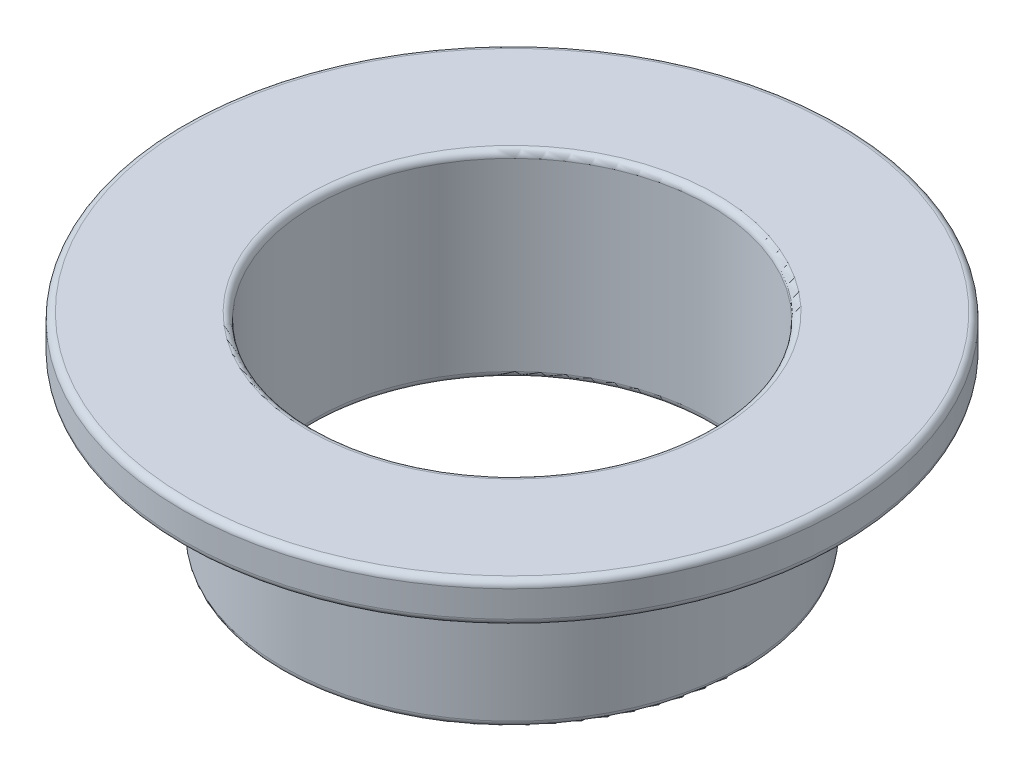
ISO-10303-21;
HEADER;
FILE_DESCRIPTION(('STEP AP214'),'2;1');
FILE_NAME('part.step','',(''),(''),'','','');
FILE_SCHEMA(('AUTOMOTIVE_DESIGN { 1 0 10303 214 1 1 1 1 }'));
ENDSEC;
DATA;
#1=APPLICATION_CONTEXT('core data for automotive mechanical design processes');
#2=APPLICATION_PROTOCOL_DEFINITION('international standard','automotive_design',2000,#1);
#3=PRODUCT_CONTEXT('',#1,'mechanical');
#4=PRODUCT('Part','Part','',(#3));
#5=PRODUCT_RELATED_PRODUCT_CATEGORY('part','',(#4));
#6=PRODUCT_DEFINITION_FORMATION('','',#4);
#7=PRODUCT_DEFINITION_CONTEXT('part definition',#1,'design');
#8=PRODUCT_DEFINITION('design','',#6,#7);
#9=PRODUCT_DEFINITION_SHAPE('','',#8);
#10=(LENGTH_UNIT() NAMED_UNIT(*) SI_UNIT(.MILLI.,.METRE.));
#11=(NAMED_UNIT(*) PLANE_ANGLE_UNIT() SI_UNIT($,.RADIAN.));
#12=(NAMED_UNIT(*) SI_UNIT($,.STERADIAN.) SOLID_ANGLE_UNIT());
#13=UNCERTAINTY_MEASURE_WITH_UNIT(LENGTH_MEASURE(1.E-05),#10,'distance_accuracy_value','');
#14=(GEOMETRIC_REPRESENTATION_CONTEXT(3) GLOBAL_UNCERTAINTY_ASSIGNED_CONTEXT((#13)) GLOBAL_UNIT_ASSIGNED_CONTEXT((#10,
#11,#12)) REPRESENTATION_CONTEXT('',''));
#15=CARTESIAN_POINT('',(0.,0.,0.));
#16=DIRECTION('',(0.,0.,1.));
#17=DIRECTION('',(1.,0.,0.));
#18=AXIS2_PLACEMENT_3D('',#15,#16,#17);
#19=CARTESIAN_POINT('',(0.,6.,0.));
#20=DIRECTION('',(0.,-1.,0.));
#21=DIRECTION('',(0.,0.,-1.));
#22=AXIS2_PLACEMENT_3D('',#19,#20,#21);
#23=CYLINDRICAL_SURFACE('',#22,7.);
#24=CARTESIAN_POINT('',(0.,0.2,0.));
#25=DIRECTION('',(0.,1.,0.));
#26=DIRECTION('',(0.,0.,1.));
#27=AXIS2_PLACEMENT_3D('',#24,#25,#26);
#28=CIRCLE('',#27,7.);
#29=CARTESIAN_POINT('',(0.,0.2,7.));
#30=VERTEX_POINT('',#29);
#31=EDGE_CURVE('E55',#30,#30,#28,.T.);
#32=ORIENTED_EDGE('',*,*,#31,.T.);
#33=EDGE_LOOP('',(#32));
#34=FACE_BOUND('',#33,.T.);
#35=CARTESIAN_POINT('',(0.,4.8,0.));
#36=DIRECTION('',(0.,1.,0.));
#37=DIRECTION('',(0.,0.,1.));
#38=AXIS2_PLACEMENT_3D('',#35,#36,#37);
#39=CIRCLE('',#38,7.);
#40=CARTESIAN_POINT('',(0.,4.8,7.));
#41=VERTEX_POINT('',#40);
#42=EDGE_CURVE('E85',#41,#41,#39,.T.);
#43=ORIENTED_EDGE('',*,*,#42,.F.);
#44=EDGE_LOOP('',(#43));
#45=FACE_BOUND('',#44,.T.);
#46=ADVANCED_FACE('F37',(#34,#45),#23,.T.);
#47=CARTESIAN_POINT('',(0.,6.,0.));
#48=DIRECTION('',(0.,1.,0.));
#49=DIRECTION('',(0.,0.,1.));
#50=AXIS2_PLACEMENT_3D('',#47,#48,#49);
#51=PLANE('',#50);
#52=CARTESIAN_POINT('',(0.,6.,0.));
#53=DIRECTION('',(0.,1.,0.));
#54=DIRECTION('',(0.,0.,1.));
#55=AXIS2_PLACEMENT_3D('',#52,#53,#54);
#56=CIRCLE('',#55,6.2);
#57=CARTESIAN_POINT('',(0.,6.,6.2));
#58=VERTEX_POINT('',#57);
#59=EDGE_CURVE('E69',#58,#58,#56,.F.);
#60=ORIENTED_EDGE('',*,*,#59,.T.);
#61=EDGE_LOOP('',(#60));
#62=FACE_BOUND('',#61,.T.);
#63=CARTESIAN_POINT('',(0.,6.,0.));
#64=DIRECTION('',(0.,1.,0.));
#65=DIRECTION('',(0.,0.,1.));
#66=AXIS2_PLACEMENT_3D('',#63,#64,#65);
#67=CIRCLE('',#66,9.8);
#68=CARTESIAN_POINT('',(0.,6.,9.8));
#69=VERTEX_POINT('',#68);
#70=EDGE_CURVE('E73',#69,#69,#67,.T.);
#71=ORIENTED_EDGE('',*,*,#70,.T.);
#72=EDGE_LOOP('',(#71));
#73=FACE_BOUND('',#72,.T.);
#74=ADVANCED_FACE('F93',(#62,#73),#51,.T.);
#75=CARTESIAN_POINT('',(0.,0.,0.));
#76=DIRECTION('',(0.,1.,0.));
#77=DIRECTION('',(0.,0.,1.));
#78=AXIS2_PLACEMENT_3D('',#75,#76,#77);
#79=PLANE('',#78);
#80=CARTESIAN_POINT('',(0.,0.,0.));
#81=DIRECTION('',(0.,1.,0.));
#82=DIRECTION('',(0.,0.,1.));
#83=AXIS2_PLACEMENT_3D('',#80,#81,#82);
#84=CIRCLE('',#83,6.2);
#85=CARTESIAN_POINT('',(0.,0.,6.2));
#86=VERTEX_POINT('',#85);
#87=EDGE_CURVE('E61',#86,#86,#84,.T.);
#88=ORIENTED_EDGE('',*,*,#87,.T.);
#89=EDGE_LOOP('',(#88));
#90=FACE_BOUND('',#89,.T.);
#91=CARTESIAN_POINT('',(0.,0.,0.));
#92=DIRECTION('',(0.,1.,0.));
#93=DIRECTION('',(0.,0.,1.));
#94=AXIS2_PLACEMENT_3D('',#91,#92,#93);
#95=CIRCLE('',#94,6.8);
#96=CARTESIAN_POINT('',(0.,0.,6.8));
#97=VERTEX_POINT('',#96);
#98=EDGE_CURVE('E65',#97,#97,#95,.F.);
#99=ORIENTED_EDGE('',*,*,#98,.T.);
#100=EDGE_LOOP('',(#99));
#101=FACE_BOUND('',#100,.T.);
#102=ADVANCED_FACE('F99',(#90,#101),#79,.F.);
#103=CARTESIAN_POINT('',(0.,6.,0.));
#104=DIRECTION('',(0.,-1.,0.));
#105=DIRECTION('',(0.,0.,-1.));
#106=AXIS2_PLACEMENT_3D('',#103,#104,#105);
#107=CYLINDRICAL_SURFACE('',#106,6.);
#108=CARTESIAN_POINT('',(0.,5.8,0.));
#109=DIRECTION('',(0.,1.,0.));
#110=DIRECTION('',(0.,0.,1.));
#111=AXIS2_PLACEMENT_3D('',#108,#109,#110);
#112=CIRCLE('',#111,6.);
#113=CARTESIAN_POINT('',(0.,5.8,6.));
#114=VERTEX_POINT('',#113);
#115=EDGE_CURVE('E77',#114,#114,#112,.T.);
#116=ORIENTED_EDGE('',*,*,#115,.T.);
#117=EDGE_LOOP('',(#116));
#118=FACE_BOUND('',#117,.T.);
#119=CARTESIAN_POINT('',(0.,0.2,0.));
#120=DIRECTION('',(0.,1.,0.));
#121=DIRECTION('',(0.,0.,1.));
#122=AXIS2_PLACEMENT_3D('',#119,#120,#121);
#123=CIRCLE('',#122,6.);
#124=CARTESIAN_POINT('',(0.,0.2,6.));
#125=VERTEX_POINT('',#124);
#126=EDGE_CURVE('E81',#125,#125,#123,.F.);
#127=ORIENTED_EDGE('',*,*,#126,.T.);
#128=EDGE_LOOP('',(#127));
#129=FACE_BOUND('',#128,.T.);
#130=ADVANCED_FACE('F136',(#118,#129),#107,.F.);
#131=CARTESIAN_POINT('',(0.,4.8,0.));
#132=DIRECTION('',(0.,1.,0.));
#133=DIRECTION('',(0.,0.,1.));
#134=AXIS2_PLACEMENT_3D('',#131,#132,#133);
#135=PLANE('',#134);
#136=CARTESIAN_POINT('',(0.,4.8,0.));
#137=DIRECTION('',(0.,1.,0.));
#138=DIRECTION('',(0.,0.,1.));
#139=AXIS2_PLACEMENT_3D('',#136,#137,#138);
#140=CIRCLE('',#139,9.8);
#141=CARTESIAN_POINT('',(0.,4.8,9.8));
#142=VERTEX_POINT('',#141);
#143=EDGE_CURVE('E10',#142,#142,#140,.F.);
#144=ORIENTED_EDGE('',*,*,#143,.T.);
#145=EDGE_LOOP('',(#144));
#146=FACE_BOUND('',#145,.T.);
#147=ORIENTED_EDGE('',*,*,#42,.T.);
#148=EDGE_LOOP('',(#147));
#149=FACE_BOUND('',#148,.T.);
#150=ADVANCED_FACE('F90',(#146,#149),#135,.F.);
#151=CARTESIAN_POINT('',(0.,4.8,0.));
#152=DIRECTION('',(0.,1.,0.));
#153=DIRECTION('',(0.,0.,1.));
#154=AXIS2_PLACEMENT_3D('',#151,#152,#153);
#155=CYLINDRICAL_SURFACE('',#154,10.);
#156=CARTESIAN_POINT('',(0.,5.8,0.));
#157=DIRECTION('',(0.,1.,0.));
#158=DIRECTION('',(0.,0.,1.));
#159=AXIS2_PLACEMENT_3D('',#156,#157,#158);
#160=CIRCLE('',#159,10.);
#161=CARTESIAN_POINT('',(0.,5.8,10.));
#162=VERTEX_POINT('',#161);
#163=EDGE_CURVE('E45',#162,#162,#160,.F.);
#164=ORIENTED_EDGE('',*,*,#163,.T.);
#165=EDGE_LOOP('',(#164));
#166=FACE_BOUND('',#165,.T.);
#167=CARTESIAN_POINT('',(0.,5.,0.));
#168=DIRECTION('',(0.,1.,0.));
#169=DIRECTION('',(0.,0.,1.));
#170=AXIS2_PLACEMENT_3D('',#167,#168,#169);
#171=CIRCLE('',#170,10.);
#172=CARTESIAN_POINT('',(0.,5.,10.));
#173=VERTEX_POINT('',#172);
#174=EDGE_CURVE('E50',#173,#173,#171,.T.);
#175=ORIENTED_EDGE('',*,*,#174,.T.);
#176=EDGE_LOOP('',(#175));
#177=FACE_BOUND('',#176,.T.);
#178=ADVANCED_FACE('F108',(#166,#177),#155,.T.);
#179=CARTESIAN_POINT('',(0.,5.8,0.));
#180=DIRECTION('',(0.,1.,0.));
#181=DIRECTION('',(0.,0.,1.));
#182=AXIS2_PLACEMENT_3D('',#179,#180,#181);
#183=TOROIDAL_SURFACE('',#182,6.2,0.2);
#184=ORIENTED_EDGE('',*,*,#59,.F.);
#185=EDGE_LOOP('',(#184));
#186=FACE_BOUND('',#185,.T.);
#187=ORIENTED_EDGE('',*,*,#115,.F.);
#188=EDGE_LOOP('',(#187));
#189=FACE_BOUND('',#188,.T.);
#190=ADVANCED_FACE('F104',(#186,#189),#183,.T.);
#191=CARTESIAN_POINT('',(0.,0.2,0.));
#192=DIRECTION('',(0.,1.,0.));
#193=DIRECTION('',(0.,0.,1.));
#194=AXIS2_PLACEMENT_3D('',#191,#192,#193);
#195=TOROIDAL_SURFACE('',#194,6.2,0.2);
#196=ORIENTED_EDGE('',*,*,#126,.F.);
#197=EDGE_LOOP('',(#196));
#198=FACE_BOUND('',#197,.T.);
#199=ORIENTED_EDGE('',*,*,#87,.F.);
#200=EDGE_LOOP('',(#199));
#201=FACE_BOUND('',#200,.T.);
#202=ADVANCED_FACE('F107',(#198,#201),#195,.T.);
#203=CARTESIAN_POINT('',(0.,0.2,0.));
#204=DIRECTION('',(0.,1.,0.));
#205=DIRECTION('',(0.,0.,1.));
#206=AXIS2_PLACEMENT_3D('',#203,#204,#205);
#207=TOROIDAL_SURFACE('',#206,6.8,0.2);
#208=ORIENTED_EDGE('',*,*,#98,.F.);
#209=EDGE_LOOP('',(#208));
#210=FACE_BOUND('',#209,.T.);
#211=ORIENTED_EDGE('',*,*,#31,.F.);
#212=EDGE_LOOP('',(#211));
#213=FACE_BOUND('',#212,.T.);
#214=ADVANCED_FACE('F112',(#210,#213),#207,.T.);
#215=CARTESIAN_POINT('',(0.,5.8,0.));
#216=DIRECTION('',(0.,1.,0.));
#217=DIRECTION('',(0.,0.,1.));
#218=AXIS2_PLACEMENT_3D('',#215,#216,#217);
#219=TOROIDAL_SURFACE('',#218,9.8,0.2);
#220=ORIENTED_EDGE('',*,*,#163,.F.);
#221=EDGE_LOOP('',(#220));
#222=FACE_BOUND('',#221,.T.);
#223=ORIENTED_EDGE('',*,*,#70,.F.);
#224=EDGE_LOOP('',(#223));
#225=FACE_BOUND('',#224,.T.);
#226=ADVANCED_FACE('F115',(#222,#225),#219,.T.);
#227=CARTESIAN_POINT('',(0.,5.,0.));
#228=DIRECTION('',(0.,1.,0.));
#229=DIRECTION('',(0.,0.,1.));
#230=AXIS2_PLACEMENT_3D('',#227,#228,#229);
#231=TOROIDAL_SURFACE('',#230,9.8,0.2);
#232=ORIENTED_EDGE('',*,*,#143,.F.);
#233=EDGE_LOOP('',(#232));
#234=FACE_BOUND('',#233,.T.);
#235=ORIENTED_EDGE('',*,*,#174,.F.);
#236=EDGE_LOOP('',(#235));
#237=FACE_BOUND('',#236,.T.);
#238=ADVANCED_FACE('F39',(#234,#237),#231,.T.);
#239=CLOSED_SHELL('',(#46,#74,#102,#130,#150,#178,#190,#202,#214,#226,#238));
#240=MANIFOLD_SOLID_BREP('B2',#239);
#241=ADVANCED_BREP_SHAPE_REPRESENTATION('',(#18,#240),#14);
#242=SHAPE_DEFINITION_REPRESENTATION(#9,#241);
ENDSEC;
END-ISO-10303-21;
